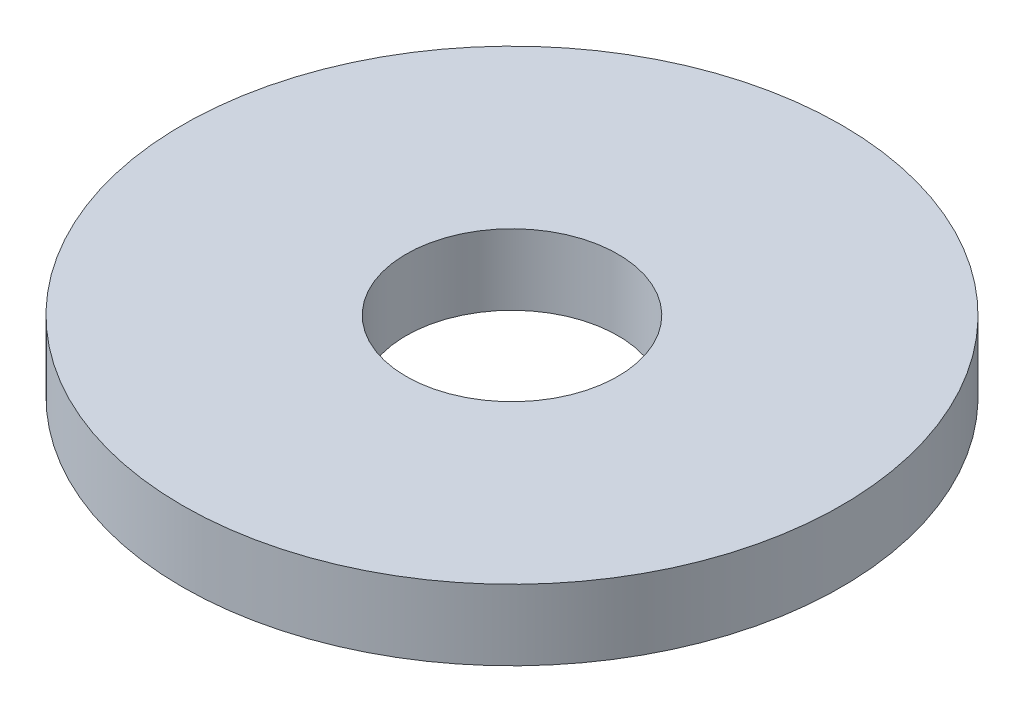
ISO-10303-21;
HEADER;
FILE_DESCRIPTION(('STEP AP214'),'2;1');
FILE_NAME('part.step','',(''),(''),'','','');
FILE_SCHEMA(('AUTOMOTIVE_DESIGN { 1 0 10303 214 1 1 1 1 }'));
ENDSEC;
DATA;
#1=APPLICATION_CONTEXT('core data for automotive mechanical design processes');
#2=APPLICATION_PROTOCOL_DEFINITION('international standard','automotive_design',2000,#1);
#3=PRODUCT_CONTEXT('',#1,'mechanical');
#4=PRODUCT('Part','Part','',(#3));
#5=PRODUCT_RELATED_PRODUCT_CATEGORY('part','',(#4));
#6=PRODUCT_DEFINITION_FORMATION('','',#4);
#7=PRODUCT_DEFINITION_CONTEXT('part definition',#1,'design');
#8=PRODUCT_DEFINITION('design','',#6,#7);
#9=PRODUCT_DEFINITION_SHAPE('','',#8);
#10=(LENGTH_UNIT() NAMED_UNIT(*) SI_UNIT(.MILLI.,.METRE.));
#11=(NAMED_UNIT(*) PLANE_ANGLE_UNIT() SI_UNIT($,.RADIAN.));
#12=(NAMED_UNIT(*) SI_UNIT($,.STERADIAN.) SOLID_ANGLE_UNIT());
#13=UNCERTAINTY_MEASURE_WITH_UNIT(LENGTH_MEASURE(1.E-05),#10,'distance_accuracy_value','');
#14=(GEOMETRIC_REPRESENTATION_CONTEXT(3) GLOBAL_UNCERTAINTY_ASSIGNED_CONTEXT((#13)) GLOBAL_UNIT_ASSIGNED_CONTEXT((#10,
#11,#12)) REPRESENTATION_CONTEXT('',''));
#15=CARTESIAN_POINT('',(0.,0.,0.));
#16=DIRECTION('',(0.,0.,1.));
#17=DIRECTION('',(1.,0.,0.));
#18=AXIS2_PLACEMENT_3D('',#15,#16,#17);
#19=CARTESIAN_POINT('',(0.,-3.,0.));
#20=DIRECTION('',(0.,1.,0.));
#21=DIRECTION('',(0.,0.,1.));
#22=AXIS2_PLACEMENT_3D('',#19,#20,#21);
#23=CYLINDRICAL_SURFACE('',#22,14.);
#24=CARTESIAN_POINT('',(0.,-3.,0.));
#25=DIRECTION('',(0.,1.,0.));
#26=DIRECTION('',(0.,0.,1.));
#27=AXIS2_PLACEMENT_3D('',#24,#25,#26);
#28=CIRCLE('',#27,14.);
#29=CARTESIAN_POINT('',(0.,-3.,14.));
#30=VERTEX_POINT('',#29);
#31=EDGE_CURVE('E10',#30,#30,#28,.T.);
#32=ORIENTED_EDGE('',*,*,#31,.T.);
#33=EDGE_LOOP('',(#32));
#34=FACE_BOUND('',#33,.T.);
#35=CARTESIAN_POINT('',(0.,0.,0.));
#36=DIRECTION('',(0.,1.,0.));
#37=DIRECTION('',(0.,0.,1.));
#38=AXIS2_PLACEMENT_3D('',#35,#36,#37);
#39=CIRCLE('',#38,14.);
#40=CARTESIAN_POINT('',(0.,0.,14.));
#41=VERTEX_POINT('',#40);
#42=EDGE_CURVE('E34',#41,#41,#39,.T.);
#43=ORIENTED_EDGE('',*,*,#42,.F.);
#44=EDGE_LOOP('',(#43));
#45=FACE_BOUND('',#44,.T.);
#46=ADVANCED_FACE('F31',(#34,#45),#23,.T.);
#47=CARTESIAN_POINT('',(0.,-3.,0.));
#48=DIRECTION('',(0.,1.,0.));
#49=DIRECTION('',(0.,0.,1.));
#50=AXIS2_PLACEMENT_3D('',#47,#48,#49);
#51=PLANE('',#50);
#52=CARTESIAN_POINT('',(0.,-3.,0.));
#53=DIRECTION('',(0.,1.,0.));
#54=DIRECTION('',(0.,0.,1.));
#55=AXIS2_PLACEMENT_3D('',#52,#53,#54);
#56=CIRCLE('',#55,4.5);
#57=CARTESIAN_POINT('',(0.,-3.,4.5));
#58=VERTEX_POINT('',#57);
#59=EDGE_CURVE('E41',#58,#58,#56,.T.);
#60=ORIENTED_EDGE('',*,*,#59,.T.);
#61=EDGE_LOOP('',(#60));
#62=FACE_BOUND('',#61,.T.);
#63=ORIENTED_EDGE('',*,*,#31,.F.);
#64=EDGE_LOOP('',(#63));
#65=FACE_BOUND('',#64,.T.);
#66=ADVANCED_FACE('F49',(#62,#65),#51,.F.);
#67=CARTESIAN_POINT('',(0.,0.,0.));
#68=DIRECTION('',(0.,1.,0.));
#69=DIRECTION('',(0.,0.,1.));
#70=AXIS2_PLACEMENT_3D('',#67,#68,#69);
#71=PLANE('',#70);
#72=CARTESIAN_POINT('',(0.,0.,0.));
#73=DIRECTION('',(0.,1.,0.));
#74=DIRECTION('',(0.,0.,1.));
#75=AXIS2_PLACEMENT_3D('',#72,#73,#74);
#76=CIRCLE('',#75,4.5);
#77=CARTESIAN_POINT('',(0.,0.,4.5));
#78=VERTEX_POINT('',#77);
#79=EDGE_CURVE('E43',#78,#78,#76,.T.);
#80=ORIENTED_EDGE('',*,*,#79,.F.);
#81=EDGE_LOOP('',(#80));
#82=FACE_BOUND('',#81,.T.);
#83=ORIENTED_EDGE('',*,*,#42,.T.);
#84=EDGE_LOOP('',(#83));
#85=FACE_BOUND('',#84,.T.);
#86=ADVANCED_FACE('F55',(#82,#85),#71,.T.);
#87=CARTESIAN_POINT('',(0.,-3.,0.));
#88=DIRECTION('',(0.,1.,0.));
#89=DIRECTION('',(0.,0.,1.));
#90=AXIS2_PLACEMENT_3D('',#87,#88,#89);
#91=CYLINDRICAL_SURFACE('',#90,4.5);
#92=ORIENTED_EDGE('',*,*,#59,.F.);
#93=EDGE_LOOP('',(#92));
#94=FACE_BOUND('',#93,.T.);
#95=ORIENTED_EDGE('',*,*,#79,.T.);
#96=EDGE_LOOP('',(#95));
#97=FACE_BOUND('',#96,.T.);
#98=ADVANCED_FACE('F52',(#94,#97),#91,.F.);
#99=CLOSED_SHELL('',(#46,#66,#86,#98));
#100=MANIFOLD_SOLID_BREP('B2',#99);
#101=ADVANCED_BREP_SHAPE_REPRESENTATION('',(#18,#100),#14);
#102=SHAPE_DEFINITION_REPRESENTATION(#9,#101);
ENDSEC;
END-ISO-10303-21;
